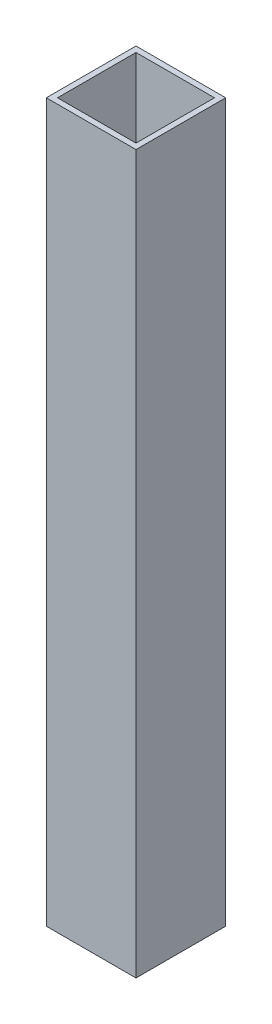
ISO-10303-21;
HEADER;
FILE_DESCRIPTION(('STEP AP214'),'2;1');
FILE_NAME('part.step','',(''),(''),'','','');
FILE_SCHEMA(('AUTOMOTIVE_DESIGN { 1 0 10303 214 1 1 1 1 }'));
ENDSEC;
DATA;
#1=APPLICATION_CONTEXT('core data for automotive mechanical design processes');
#2=APPLICATION_PROTOCOL_DEFINITION('international standard','automotive_design',2000,#1);
#3=PRODUCT_CONTEXT('',#1,'mechanical');
#4=PRODUCT('Part','Part','',(#3));
#5=PRODUCT_RELATED_PRODUCT_CATEGORY('part','',(#4));
#6=PRODUCT_DEFINITION_FORMATION('','',#4);
#7=PRODUCT_DEFINITION_CONTEXT('part definition',#1,'design');
#8=PRODUCT_DEFINITION('design','',#6,#7);
#9=PRODUCT_DEFINITION_SHAPE('','',#8);
#10=(LENGTH_UNIT() NAMED_UNIT(*) SI_UNIT(.MILLI.,.METRE.));
#11=(NAMED_UNIT(*) PLANE_ANGLE_UNIT() SI_UNIT($,.RADIAN.));
#12=(NAMED_UNIT(*) SI_UNIT($,.STERADIAN.) SOLID_ANGLE_UNIT());
#13=UNCERTAINTY_MEASURE_WITH_UNIT(LENGTH_MEASURE(1.E-05),#10,'distance_accuracy_value','');
#14=(GEOMETRIC_REPRESENTATION_CONTEXT(3) GLOBAL_UNCERTAINTY_ASSIGNED_CONTEXT((#13)) GLOBAL_UNIT_ASSIGNED_CONTEXT((#10,
#11,#12)) REPRESENTATION_CONTEXT('',''));
#15=CARTESIAN_POINT('',(0.,0.,0.));
#16=DIRECTION('',(0.,0.,1.));
#17=DIRECTION('',(1.,0.,0.));
#18=AXIS2_PLACEMENT_3D('',#15,#16,#17);
#19=CARTESIAN_POINT('',(0.,203.2,0.));
#20=DIRECTION('',(0.,-1.,0.));
#21=DIRECTION('',(0.,0.,-1.));
#22=AXIS2_PLACEMENT_3D('',#19,#20,#21);
#23=PLANE('',#22);
#24=DIRECTION('',(0.,0.,-1.));
#25=VECTOR('',#24,1.);
#26=CARTESIAN_POINT('',(12.7,203.2,12.7));
#27=LINE('',#26,#25);
#28=CARTESIAN_POINT('',(12.7,203.2,12.7));
#29=VERTEX_POINT('',#28);
#30=CARTESIAN_POINT('',(12.7,203.2,-12.7));
#31=VERTEX_POINT('',#30);
#32=EDGE_CURVE('E136',#29,#31,#27,.T.);
#33=ORIENTED_EDGE('',*,*,#32,.T.);
#34=DIRECTION('',(-1.,0.,0.));
#35=VECTOR('',#34,1.);
#36=CARTESIAN_POINT('',(-12.7,203.2,-12.7));
#37=LINE('',#36,#35);
#38=CARTESIAN_POINT('',(-12.7,203.2,-12.7));
#39=VERTEX_POINT('',#38);
#40=EDGE_CURVE('E139',#31,#39,#37,.T.);
#41=ORIENTED_EDGE('',*,*,#40,.T.);
#42=DIRECTION('',(0.,0.,1.));
#43=VECTOR('',#42,1.);
#44=CARTESIAN_POINT('',(-12.7,203.2,12.7));
#45=LINE('',#44,#43);
#46=CARTESIAN_POINT('',(-12.7,203.2,12.7));
#47=VERTEX_POINT('',#46);
#48=EDGE_CURVE('E142',#39,#47,#45,.T.);
#49=ORIENTED_EDGE('',*,*,#48,.T.);
#50=DIRECTION('',(1.,0.,0.));
#51=VECTOR('',#50,1.);
#52=CARTESIAN_POINT('',(-12.7,203.2,12.7));
#53=LINE('',#52,#51);
#54=EDGE_CURVE('E144',#47,#29,#53,.T.);
#55=ORIENTED_EDGE('',*,*,#54,.T.);
#56=EDGE_LOOP('',(#33,#41,#49,#55));
#57=FACE_BOUND('',#56,.T.);
#58=DIRECTION('',(0.,0.,-1.));
#59=VECTOR('',#58,1.);
#60=CARTESIAN_POINT('',(11.1125,203.2,11.1125));
#61=LINE('',#60,#59);
#62=CARTESIAN_POINT('',(11.1125,203.2,11.1125));
#63=VERTEX_POINT('',#62);
#64=CARTESIAN_POINT('',(11.1125,203.2,-11.1125));
#65=VERTEX_POINT('',#64);
#66=EDGE_CURVE('E100',#63,#65,#61,.T.);
#67=ORIENTED_EDGE('',*,*,#66,.F.);
#68=DIRECTION('',(1.,0.,0.));
#69=VECTOR('',#68,1.);
#70=CARTESIAN_POINT('',(-11.1125,203.2,11.1125));
#71=LINE('',#70,#69);
#72=CARTESIAN_POINT('',(-11.1125,203.2,11.1125));
#73=VERTEX_POINT('',#72);
#74=EDGE_CURVE('E122',#73,#63,#71,.T.);
#75=ORIENTED_EDGE('',*,*,#74,.F.);
#76=DIRECTION('',(0.,0.,1.));
#77=VECTOR('',#76,1.);
#78=CARTESIAN_POINT('',(-11.1125,203.2,11.1125));
#79=LINE('',#78,#77);
#80=CARTESIAN_POINT('',(-11.1125,203.2,-11.1125));
#81=VERTEX_POINT('',#80);
#82=EDGE_CURVE('E120',#81,#73,#79,.T.);
#83=ORIENTED_EDGE('',*,*,#82,.F.);
#84=DIRECTION('',(-1.,0.,0.));
#85=VECTOR('',#84,1.);
#86=CARTESIAN_POINT('',(-11.1125,203.2,-11.1125));
#87=LINE('',#86,#85);
#88=EDGE_CURVE('E108',#65,#81,#87,.T.);
#89=ORIENTED_EDGE('',*,*,#88,.F.);
#90=EDGE_LOOP('',(#67,#75,#83,#89));
#91=FACE_BOUND('',#90,.T.);
#92=ADVANCED_FACE('F35',(#57,#91),#23,.F.);
#93=CARTESIAN_POINT('',(0.,0.,0.));
#94=DIRECTION('',(0.,-1.,0.));
#95=DIRECTION('',(0.,0.,-1.));
#96=AXIS2_PLACEMENT_3D('',#93,#94,#95);
#97=PLANE('',#96);
#98=DIRECTION('',(0.,0.,-1.));
#99=VECTOR('',#98,1.);
#100=CARTESIAN_POINT('',(12.7,0.,12.7));
#101=LINE('',#100,#99);
#102=CARTESIAN_POINT('',(12.7,0.,12.7));
#103=VERTEX_POINT('',#102);
#104=CARTESIAN_POINT('',(12.7,0.,-12.7));
#105=VERTEX_POINT('',#104);
#106=EDGE_CURVE('E116',#103,#105,#101,.T.);
#107=ORIENTED_EDGE('',*,*,#106,.F.);
#108=DIRECTION('',(1.,0.,0.));
#109=VECTOR('',#108,1.);
#110=CARTESIAN_POINT('',(-12.7,0.,12.7));
#111=LINE('',#110,#109);
#112=CARTESIAN_POINT('',(-12.7,0.,12.7));
#113=VERTEX_POINT('',#112);
#114=EDGE_CURVE('E140',#113,#103,#111,.T.);
#115=ORIENTED_EDGE('',*,*,#114,.F.);
#116=DIRECTION('',(0.,0.,1.));
#117=VECTOR('',#116,1.);
#118=CARTESIAN_POINT('',(-12.7,0.,12.7));
#119=LINE('',#118,#117);
#120=CARTESIAN_POINT('',(-12.7,0.,-12.7));
#121=VERTEX_POINT('',#120);
#122=EDGE_CURVE('E151',#121,#113,#119,.T.);
#123=ORIENTED_EDGE('',*,*,#122,.F.);
#124=DIRECTION('',(-1.,0.,0.));
#125=VECTOR('',#124,1.);
#126=CARTESIAN_POINT('',(-12.7,0.,-12.7));
#127=LINE('',#126,#125);
#128=EDGE_CURVE('E149',#105,#121,#127,.T.);
#129=ORIENTED_EDGE('',*,*,#128,.F.);
#130=EDGE_LOOP('',(#107,#115,#123,#129));
#131=FACE_BOUND('',#130,.T.);
#132=DIRECTION('',(1.,0.,0.));
#133=VECTOR('',#132,1.);
#134=CARTESIAN_POINT('',(-11.1125,0.,11.1125));
#135=LINE('',#134,#133);
#136=CARTESIAN_POINT('',(-11.1125,0.,11.1125));
#137=VERTEX_POINT('',#136);
#138=CARTESIAN_POINT('',(11.1125,0.,11.1125));
#139=VERTEX_POINT('',#138);
#140=EDGE_CURVE('E109',#137,#139,#135,.T.);
#141=ORIENTED_EDGE('',*,*,#140,.T.);
#142=DIRECTION('',(0.,0.,-1.));
#143=VECTOR('',#142,1.);
#144=CARTESIAN_POINT('',(11.1125,0.,11.1125));
#145=LINE('',#144,#143);
#146=CARTESIAN_POINT('',(11.1125,0.,-11.1125));
#147=VERTEX_POINT('',#146);
#148=EDGE_CURVE('E58',#139,#147,#145,.T.);
#149=ORIENTED_EDGE('',*,*,#148,.T.);
#150=DIRECTION('',(-1.,0.,0.));
#151=VECTOR('',#150,1.);
#152=CARTESIAN_POINT('',(-11.1125,0.,-11.1125));
#153=LINE('',#152,#151);
#154=CARTESIAN_POINT('',(-11.1125,0.,-11.1125));
#155=VERTEX_POINT('',#154);
#156=EDGE_CURVE('E115',#147,#155,#153,.T.);
#157=ORIENTED_EDGE('',*,*,#156,.T.);
#158=DIRECTION('',(0.,0.,1.));
#159=VECTOR('',#158,1.);
#160=CARTESIAN_POINT('',(-11.1125,0.,11.1125));
#161=LINE('',#160,#159);
#162=EDGE_CURVE('E128',#155,#137,#161,.T.);
#163=ORIENTED_EDGE('',*,*,#162,.T.);
#164=EDGE_LOOP('',(#141,#149,#157,#163));
#165=FACE_BOUND('',#164,.T.);
#166=ADVANCED_FACE('F169',(#131,#165),#97,.T.);
#167=CARTESIAN_POINT('',(12.7,203.2,12.7));
#168=DIRECTION('',(-1.,0.,0.));
#169=DIRECTION('',(0.,0.,1.));
#170=AXIS2_PLACEMENT_3D('',#167,#168,#169);
#171=PLANE('',#170);
#172=ORIENTED_EDGE('',*,*,#106,.T.);
#173=DIRECTION('',(0.,-1.,0.));
#174=VECTOR('',#173,1.);
#175=CARTESIAN_POINT('',(12.7,203.2,-12.7));
#176=LINE('',#175,#174);
#177=EDGE_CURVE('E11',#31,#105,#176,.T.);
#178=ORIENTED_EDGE('',*,*,#177,.F.);
#179=ORIENTED_EDGE('',*,*,#32,.F.);
#180=DIRECTION('',(0.,-1.,0.));
#181=VECTOR('',#180,1.);
#182=CARTESIAN_POINT('',(12.7,203.2,12.7));
#183=LINE('',#182,#181);
#184=EDGE_CURVE('E146',#29,#103,#183,.T.);
#185=ORIENTED_EDGE('',*,*,#184,.T.);
#186=EDGE_LOOP('',(#172,#178,#179,#185));
#187=FACE_BOUND('',#186,.T.);
#188=ADVANCED_FACE('F37',(#187),#171,.F.);
#189=CARTESIAN_POINT('',(-12.7,203.2,-12.7));
#190=DIRECTION('',(0.,0.,1.));
#191=DIRECTION('',(1.,0.,0.));
#192=AXIS2_PLACEMENT_3D('',#189,#190,#191);
#193=PLANE('',#192);
#194=ORIENTED_EDGE('',*,*,#128,.T.);
#195=DIRECTION('',(0.,-1.,0.));
#196=VECTOR('',#195,1.);
#197=CARTESIAN_POINT('',(-12.7,203.2,-12.7));
#198=LINE('',#197,#196);
#199=EDGE_CURVE('E43',#39,#121,#198,.T.);
#200=ORIENTED_EDGE('',*,*,#199,.F.);
#201=ORIENTED_EDGE('',*,*,#40,.F.);
#202=ORIENTED_EDGE('',*,*,#177,.T.);
#203=EDGE_LOOP('',(#194,#200,#201,#202));
#204=FACE_BOUND('',#203,.T.);
#205=ADVANCED_FACE('F179',(#204),#193,.F.);
#206=CARTESIAN_POINT('',(-12.7,203.2,12.7));
#207=DIRECTION('',(1.,0.,0.));
#208=DIRECTION('',(0.,0.,-1.));
#209=AXIS2_PLACEMENT_3D('',#206,#207,#208);
#210=PLANE('',#209);
#211=ORIENTED_EDGE('',*,*,#122,.T.);
#212=DIRECTION('',(0.,-1.,0.));
#213=VECTOR('',#212,1.);
#214=CARTESIAN_POINT('',(-12.7,203.2,12.7));
#215=LINE('',#214,#213);
#216=EDGE_CURVE('E156',#47,#113,#215,.T.);
#217=ORIENTED_EDGE('',*,*,#216,.F.);
#218=ORIENTED_EDGE('',*,*,#48,.F.);
#219=ORIENTED_EDGE('',*,*,#199,.T.);
#220=EDGE_LOOP('',(#211,#217,#218,#219));
#221=FACE_BOUND('',#220,.T.);
#222=ADVANCED_FACE('F163',(#221),#210,.F.);
#223=CARTESIAN_POINT('',(-12.7,203.2,12.7));
#224=DIRECTION('',(0.,0.,-1.));
#225=DIRECTION('',(-1.,0.,0.));
#226=AXIS2_PLACEMENT_3D('',#223,#224,#225);
#227=PLANE('',#226);
#228=ORIENTED_EDGE('',*,*,#114,.T.);
#229=ORIENTED_EDGE('',*,*,#184,.F.);
#230=ORIENTED_EDGE('',*,*,#54,.F.);
#231=ORIENTED_EDGE('',*,*,#216,.T.);
#232=EDGE_LOOP('',(#228,#229,#230,#231));
#233=FACE_BOUND('',#232,.T.);
#234=ADVANCED_FACE('F173',(#233),#227,.F.);
#235=CARTESIAN_POINT('',(11.1125,203.2,11.1125));
#236=DIRECTION('',(-1.,0.,0.));
#237=DIRECTION('',(0.,0.,1.));
#238=AXIS2_PLACEMENT_3D('',#235,#236,#237);
#239=PLANE('',#238);
#240=ORIENTED_EDGE('',*,*,#148,.F.);
#241=DIRECTION('',(0.,-1.,0.));
#242=VECTOR('',#241,1.);
#243=CARTESIAN_POINT('',(11.1125,203.2,11.1125));
#244=LINE('',#243,#242);
#245=EDGE_CURVE('E104',#63,#139,#244,.T.);
#246=ORIENTED_EDGE('',*,*,#245,.F.);
#247=ORIENTED_EDGE('',*,*,#66,.T.);
#248=DIRECTION('',(0.,-1.,0.));
#249=VECTOR('',#248,1.);
#250=CARTESIAN_POINT('',(11.1125,203.2,-11.1125));
#251=LINE('',#250,#249);
#252=EDGE_CURVE('E103',#65,#147,#251,.T.);
#253=ORIENTED_EDGE('',*,*,#252,.T.);
#254=EDGE_LOOP('',(#240,#246,#247,#253));
#255=FACE_BOUND('',#254,.T.);
#256=ADVANCED_FACE('F102',(#255),#239,.T.);
#257=CARTESIAN_POINT('',(-11.1125,203.2,-11.1125));
#258=DIRECTION('',(0.,0.,1.));
#259=DIRECTION('',(1.,0.,0.));
#260=AXIS2_PLACEMENT_3D('',#257,#258,#259);
#261=PLANE('',#260);
#262=ORIENTED_EDGE('',*,*,#156,.F.);
#263=ORIENTED_EDGE('',*,*,#252,.F.);
#264=ORIENTED_EDGE('',*,*,#88,.T.);
#265=DIRECTION('',(0.,-1.,0.));
#266=VECTOR('',#265,1.);
#267=CARTESIAN_POINT('',(-11.1125,203.2,-11.1125));
#268=LINE('',#267,#266);
#269=EDGE_CURVE('E117',#81,#155,#268,.T.);
#270=ORIENTED_EDGE('',*,*,#269,.T.);
#271=EDGE_LOOP('',(#262,#263,#264,#270));
#272=FACE_BOUND('',#271,.T.);
#273=ADVANCED_FACE('F112',(#272),#261,.T.);
#274=CARTESIAN_POINT('',(-11.1125,203.2,11.1125));
#275=DIRECTION('',(1.,0.,0.));
#276=DIRECTION('',(0.,0.,-1.));
#277=AXIS2_PLACEMENT_3D('',#274,#275,#276);
#278=PLANE('',#277);
#279=ORIENTED_EDGE('',*,*,#162,.F.);
#280=ORIENTED_EDGE('',*,*,#269,.F.);
#281=ORIENTED_EDGE('',*,*,#82,.T.);
#282=DIRECTION('',(0.,-1.,0.));
#283=VECTOR('',#282,1.);
#284=CARTESIAN_POINT('',(-11.1125,203.2,11.1125));
#285=LINE('',#284,#283);
#286=EDGE_CURVE('E50',#73,#137,#285,.T.);
#287=ORIENTED_EDGE('',*,*,#286,.T.);
#288=EDGE_LOOP('',(#279,#280,#281,#287));
#289=FACE_BOUND('',#288,.T.);
#290=ADVANCED_FACE('F202',(#289),#278,.T.);
#291=CARTESIAN_POINT('',(-11.1125,203.2,11.1125));
#292=DIRECTION('',(0.,0.,-1.));
#293=DIRECTION('',(-1.,0.,0.));
#294=AXIS2_PLACEMENT_3D('',#291,#292,#293);
#295=PLANE('',#294);
#296=ORIENTED_EDGE('',*,*,#140,.F.);
#297=ORIENTED_EDGE('',*,*,#286,.F.);
#298=ORIENTED_EDGE('',*,*,#74,.T.);
#299=ORIENTED_EDGE('',*,*,#245,.T.);
#300=EDGE_LOOP('',(#296,#297,#298,#299));
#301=FACE_BOUND('',#300,.T.);
#302=ADVANCED_FACE('F206',(#301),#295,.T.);
#303=CLOSED_SHELL('',(#92,#166,#188,#205,#222,#234,#256,#273,#290,#302));
#304=MANIFOLD_SOLID_BREP('B2',#303);
#305=ADVANCED_BREP_SHAPE_REPRESENTATION('',(#18,#304),#14);
#306=SHAPE_DEFINITION_REPRESENTATION(#9,#305);
ENDSEC;
END-ISO-10303-21;
